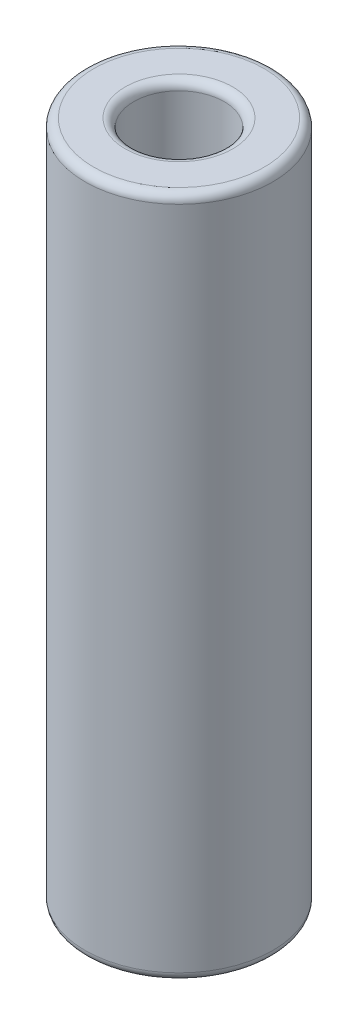
ISO-10303-21;
HEADER;
FILE_DESCRIPTION(('STEP AP214'),'2;1');
FILE_NAME('part.step','',(''),(''),'','','');
FILE_SCHEMA(('AUTOMOTIVE_DESIGN { 1 0 10303 214 1 1 1 1 }'));
ENDSEC;
DATA;
#1=APPLICATION_CONTEXT('core data for automotive mechanical design processes');
#2=APPLICATION_PROTOCOL_DEFINITION('international standard','automotive_design',2000,#1);
#3=PRODUCT_CONTEXT('',#1,'mechanical');
#4=PRODUCT('Part','Part','',(#3));
#5=PRODUCT_RELATED_PRODUCT_CATEGORY('part','',(#4));
#6=PRODUCT_DEFINITION_FORMATION('','',#4);
#7=PRODUCT_DEFINITION_CONTEXT('part definition',#1,'design');
#8=PRODUCT_DEFINITION('design','',#6,#7);
#9=PRODUCT_DEFINITION_SHAPE('','',#8);
#10=(LENGTH_UNIT() NAMED_UNIT(*) SI_UNIT(.MILLI.,.METRE.));
#11=(NAMED_UNIT(*) PLANE_ANGLE_UNIT() SI_UNIT($,.RADIAN.));
#12=(NAMED_UNIT(*) SI_UNIT($,.STERADIAN.) SOLID_ANGLE_UNIT());
#13=UNCERTAINTY_MEASURE_WITH_UNIT(LENGTH_MEASURE(1.E-05),#10,'distance_accuracy_value','');
#14=(GEOMETRIC_REPRESENTATION_CONTEXT(3) GLOBAL_UNCERTAINTY_ASSIGNED_CONTEXT((#13)) GLOBAL_UNIT_ASSIGNED_CONTEXT((#10,
#11,#12)) REPRESENTATION_CONTEXT('',''));
#15=CARTESIAN_POINT('',(0.,0.,0.));
#16=DIRECTION('',(0.,0.,1.));
#17=DIRECTION('',(1.,0.,0.));
#18=AXIS2_PLACEMENT_3D('',#15,#16,#17);
#19=CARTESIAN_POINT('',(0.,40.,0.));
#20=DIRECTION('',(0.,-1.,0.));
#21=DIRECTION('',(0.,0.,-1.));
#22=AXIS2_PLACEMENT_3D('',#19,#20,#21);
#23=CYLINDRICAL_SURFACE('',#22,5.5);
#24=CARTESIAN_POINT('',(0.,0.5,0.));
#25=DIRECTION('',(0.,1.,0.));
#26=DIRECTION('',(0.,0.,1.));
#27=AXIS2_PLACEMENT_3D('',#24,#25,#26);
#28=CIRCLE('',#27,5.5);
#29=CARTESIAN_POINT('',(0.,0.5,5.5));
#30=VERTEX_POINT('',#29);
#31=EDGE_CURVE('E55',#30,#30,#28,.T.);
#32=ORIENTED_EDGE('',*,*,#31,.T.);
#33=EDGE_LOOP('',(#32));
#34=FACE_BOUND('',#33,.T.);
#35=CARTESIAN_POINT('',(0.,39.5,0.));
#36=DIRECTION('',(0.,1.,0.));
#37=DIRECTION('',(0.,0.,1.));
#38=AXIS2_PLACEMENT_3D('',#35,#36,#37);
#39=CIRCLE('',#38,5.5);
#40=CARTESIAN_POINT('',(0.,39.5,5.5));
#41=VERTEX_POINT('',#40);
#42=EDGE_CURVE('E58',#41,#41,#39,.F.);
#43=ORIENTED_EDGE('',*,*,#42,.T.);
#44=EDGE_LOOP('',(#43));
#45=FACE_BOUND('',#44,.T.);
#46=ADVANCED_FACE('F29',(#34,#45),#23,.T.);
#47=CARTESIAN_POINT('',(0.,40.,0.));
#48=DIRECTION('',(0.,1.,0.));
#49=DIRECTION('',(0.,0.,1.));
#50=AXIS2_PLACEMENT_3D('',#47,#48,#49);
#51=PLANE('',#50);
#52=CARTESIAN_POINT('',(0.,40.,0.));
#53=DIRECTION('',(0.,1.,0.));
#54=DIRECTION('',(0.,0.,1.));
#55=AXIS2_PLACEMENT_3D('',#52,#53,#54);
#56=CIRCLE('',#55,3.15);
#57=CARTESIAN_POINT('',(0.,40.,3.15));
#58=VERTEX_POINT('',#57);
#59=EDGE_CURVE('E36',#58,#58,#56,.F.);
#60=ORIENTED_EDGE('',*,*,#59,.T.);
#61=EDGE_LOOP('',(#60));
#62=FACE_BOUND('',#61,.T.);
#63=CARTESIAN_POINT('',(0.,40.,0.));
#64=DIRECTION('',(0.,1.,0.));
#65=DIRECTION('',(0.,0.,1.));
#66=AXIS2_PLACEMENT_3D('',#63,#64,#65);
#67=CIRCLE('',#66,5.);
#68=CARTESIAN_POINT('',(0.,40.,5.));
#69=VERTEX_POINT('',#68);
#70=EDGE_CURVE('E49',#69,#69,#67,.T.);
#71=ORIENTED_EDGE('',*,*,#70,.T.);
#72=EDGE_LOOP('',(#71));
#73=FACE_BOUND('',#72,.T.);
#74=ADVANCED_FACE('F71',(#62,#73),#51,.T.);
#75=CARTESIAN_POINT('',(0.,0.,0.));
#76=DIRECTION('',(0.,1.,0.));
#77=DIRECTION('',(0.,0.,1.));
#78=AXIS2_PLACEMENT_3D('',#75,#76,#77);
#79=PLANE('',#78);
#80=CARTESIAN_POINT('',(0.,0.,0.));
#81=DIRECTION('',(0.,1.,0.));
#82=DIRECTION('',(0.,0.,1.));
#83=AXIS2_PLACEMENT_3D('',#80,#81,#82);
#84=CIRCLE('',#83,3.15);
#85=CARTESIAN_POINT('',(0.,0.,3.15));
#86=VERTEX_POINT('',#85);
#87=EDGE_CURVE('E10',#86,#86,#84,.T.);
#88=ORIENTED_EDGE('',*,*,#87,.T.);
#89=EDGE_LOOP('',(#88));
#90=FACE_BOUND('',#89,.T.);
#91=CARTESIAN_POINT('',(0.,0.,0.));
#92=DIRECTION('',(0.,1.,0.));
#93=DIRECTION('',(0.,0.,1.));
#94=AXIS2_PLACEMENT_3D('',#91,#92,#93);
#95=CIRCLE('',#94,5.);
#96=CARTESIAN_POINT('',(0.,0.,5.));
#97=VERTEX_POINT('',#96);
#98=EDGE_CURVE('E52',#97,#97,#95,.F.);
#99=ORIENTED_EDGE('',*,*,#98,.T.);
#100=EDGE_LOOP('',(#99));
#101=FACE_BOUND('',#100,.T.);
#102=ADVANCED_FACE('F73',(#90,#101),#79,.F.);
#103=CARTESIAN_POINT('',(0.,0.,0.));
#104=DIRECTION('',(0.,1.,0.));
#105=DIRECTION('',(0.,0.,1.));
#106=AXIS2_PLACEMENT_3D('',#103,#104,#105);
#107=CYLINDRICAL_SURFACE('',#106,2.65);
#108=CARTESIAN_POINT('',(0.,39.5,0.));
#109=DIRECTION('',(0.,1.,0.));
#110=DIRECTION('',(0.,0.,1.));
#111=AXIS2_PLACEMENT_3D('',#108,#109,#110);
#112=CIRCLE('',#111,2.65);
#113=CARTESIAN_POINT('',(0.,39.5,2.65));
#114=VERTEX_POINT('',#113);
#115=EDGE_CURVE('E40',#114,#114,#112,.T.);
#116=ORIENTED_EDGE('',*,*,#115,.T.);
#117=EDGE_LOOP('',(#116));
#118=FACE_BOUND('',#117,.T.);
#119=CARTESIAN_POINT('',(0.,0.5,0.));
#120=DIRECTION('',(0.,1.,0.));
#121=DIRECTION('',(0.,0.,1.));
#122=AXIS2_PLACEMENT_3D('',#119,#120,#121);
#123=CIRCLE('',#122,2.65);
#124=CARTESIAN_POINT('',(0.,0.5,2.65));
#125=VERTEX_POINT('',#124);
#126=EDGE_CURVE('E44',#125,#125,#123,.F.);
#127=ORIENTED_EDGE('',*,*,#126,.T.);
#128=EDGE_LOOP('',(#127));
#129=FACE_BOUND('',#128,.T.);
#130=ADVANCED_FACE('F79',(#118,#129),#107,.F.);
#131=CARTESIAN_POINT('',(0.,0.5,0.));
#132=DIRECTION('',(0.,1.,0.));
#133=DIRECTION('',(0.,0.,1.));
#134=AXIS2_PLACEMENT_3D('',#131,#132,#133);
#135=TOROIDAL_SURFACE('',#134,5.,0.5);
#136=ORIENTED_EDGE('',*,*,#98,.F.);
#137=EDGE_LOOP('',(#136));
#138=FACE_BOUND('',#137,.T.);
#139=ORIENTED_EDGE('',*,*,#31,.F.);
#140=EDGE_LOOP('',(#139));
#141=FACE_BOUND('',#140,.T.);
#142=ADVANCED_FACE('F67',(#138,#141),#135,.T.);
#143=CARTESIAN_POINT('',(0.,39.5,0.));
#144=DIRECTION('',(0.,1.,0.));
#145=DIRECTION('',(0.,0.,1.));
#146=AXIS2_PLACEMENT_3D('',#143,#144,#145);
#147=TOROIDAL_SURFACE('',#146,5.,0.5);
#148=ORIENTED_EDGE('',*,*,#42,.F.);
#149=EDGE_LOOP('',(#148));
#150=FACE_BOUND('',#149,.T.);
#151=ORIENTED_EDGE('',*,*,#70,.F.);
#152=EDGE_LOOP('',(#151));
#153=FACE_BOUND('',#152,.T.);
#154=ADVANCED_FACE('F63',(#150,#153),#147,.T.);
#155=CARTESIAN_POINT('',(0.,39.5,0.));
#156=DIRECTION('',(0.,1.,0.));
#157=DIRECTION('',(0.,0.,1.));
#158=AXIS2_PLACEMENT_3D('',#155,#156,#157);
#159=TOROIDAL_SURFACE('',#158,3.15,0.5);
#160=ORIENTED_EDGE('',*,*,#59,.F.);
#161=EDGE_LOOP('',(#160));
#162=FACE_BOUND('',#161,.T.);
#163=ORIENTED_EDGE('',*,*,#115,.F.);
#164=EDGE_LOOP('',(#163));
#165=FACE_BOUND('',#164,.T.);
#166=ADVANCED_FACE('F66',(#162,#165),#159,.T.);
#167=CARTESIAN_POINT('',(0.,0.5,0.));
#168=DIRECTION('',(0.,1.,0.));
#169=DIRECTION('',(0.,0.,1.));
#170=AXIS2_PLACEMENT_3D('',#167,#168,#169);
#171=TOROIDAL_SURFACE('',#170,3.15,0.5);
#172=ORIENTED_EDGE('',*,*,#126,.F.);
#173=EDGE_LOOP('',(#172));
#174=FACE_BOUND('',#173,.T.);
#175=ORIENTED_EDGE('',*,*,#87,.F.);
#176=EDGE_LOOP('',(#175));
#177=FACE_BOUND('',#176,.T.);
#178=ADVANCED_FACE('F31',(#174,#177),#171,.T.);
#179=CLOSED_SHELL('',(#46,#74,#102,#130,#142,#154,#166,#178));
#180=MANIFOLD_SOLID_BREP('B2',#179);
#181=ADVANCED_BREP_SHAPE_REPRESENTATION('',(#18,#180),#14);
#182=SHAPE_DEFINITION_REPRESENTATION(#9,#181);
ENDSEC;
END-ISO-10303-21;
